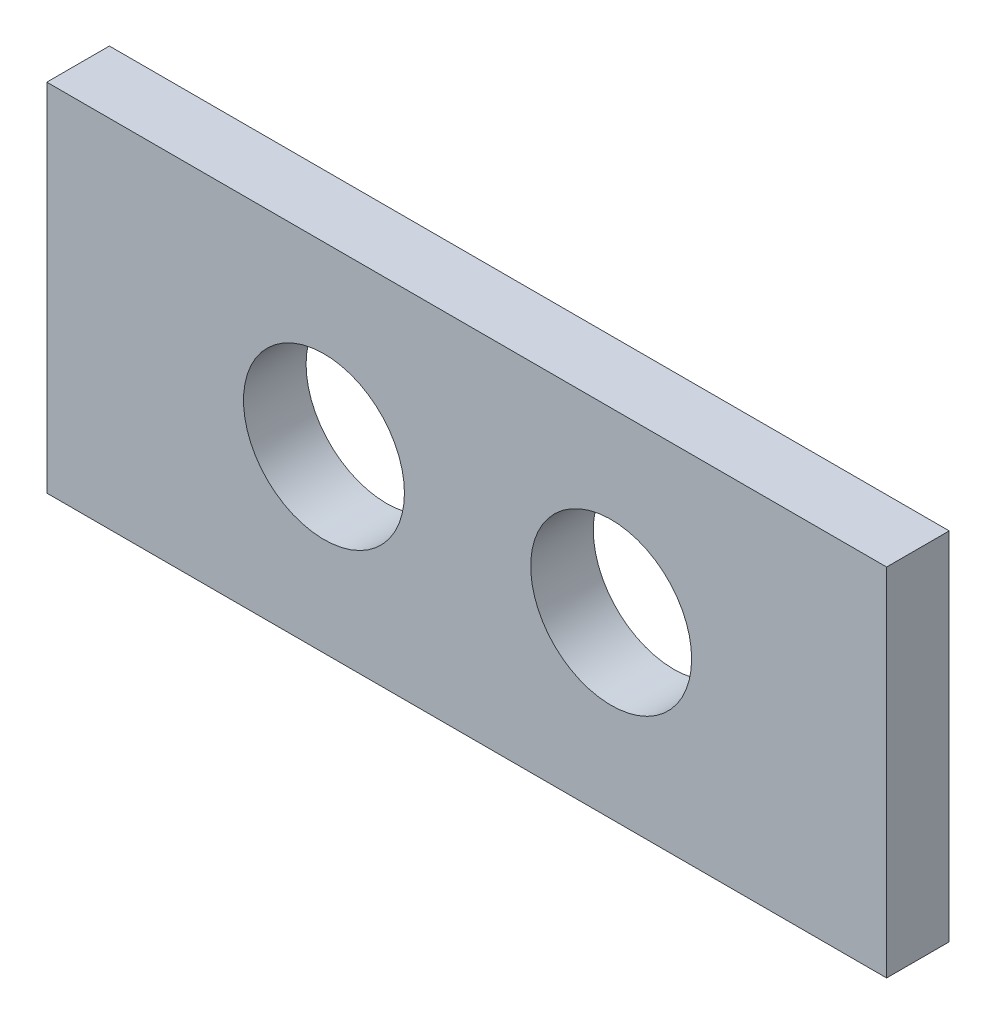
ISO-10303-21;
HEADER;
FILE_DESCRIPTION(('STEP AP214'),'2;1');
FILE_NAME('part.step','',(''),(''),'','','');
FILE_SCHEMA(('AUTOMOTIVE_DESIGN { 1 0 10303 214 1 1 1 1 }'));
ENDSEC;
DATA;
#1=APPLICATION_CONTEXT('core data for automotive mechanical design processes');
#2=APPLICATION_PROTOCOL_DEFINITION('international standard','automotive_design',2000,#1);
#3=PRODUCT_CONTEXT('',#1,'mechanical');
#4=PRODUCT('Part','Part','',(#3));
#5=PRODUCT_RELATED_PRODUCT_CATEGORY('part','',(#4));
#6=PRODUCT_DEFINITION_FORMATION('','',#4);
#7=PRODUCT_DEFINITION_CONTEXT('part definition',#1,'design');
#8=PRODUCT_DEFINITION('design','',#6,#7);
#9=PRODUCT_DEFINITION_SHAPE('','',#8);
#10=(LENGTH_UNIT() NAMED_UNIT(*) SI_UNIT(.MILLI.,.METRE.));
#11=(NAMED_UNIT(*) PLANE_ANGLE_UNIT() SI_UNIT($,.RADIAN.));
#12=(NAMED_UNIT(*) SI_UNIT($,.STERADIAN.) SOLID_ANGLE_UNIT());
#13=UNCERTAINTY_MEASURE_WITH_UNIT(LENGTH_MEASURE(1.E-05),#10,'distance_accuracy_value','');
#14=(GEOMETRIC_REPRESENTATION_CONTEXT(3) GLOBAL_UNCERTAINTY_ASSIGNED_CONTEXT((#13)) GLOBAL_UNIT_ASSIGNED_CONTEXT((#10,
#11,#12)) REPRESENTATION_CONTEXT('',''));
#15=CARTESIAN_POINT('',(0.,0.,0.));
#16=DIRECTION('',(0.,0.,1.));
#17=DIRECTION('',(1.,0.,0.));
#18=AXIS2_PLACEMENT_3D('',#15,#16,#17);
#19=CARTESIAN_POINT('',(0.,0.,228.01579999998));
#20=DIRECTION('',(0.,0.,-1.));
#21=DIRECTION('',(-1.,0.,0.));
#22=AXIS2_PLACEMENT_3D('',#19,#20,#21);
#23=PLANE('',#22);
#24=DIRECTION('',(0.,-1.,0.));
#25=VECTOR('',#24,1.);
#26=CARTESIAN_POINT('',(99.8991867373068,-267.892021918219,228.01579999998));
#27=LINE('',#26,#25);
#28=CARTESIAN_POINT('',(99.8991867373068,31.4461867373068,228.01579999998));
#29=VERTEX_POINT('',#28);
#30=CARTESIAN_POINT('',(99.8991867373068,-31.75,228.01579999998));
#31=VERTEX_POINT('',#30);
#32=EDGE_CURVE('E99',#29,#31,#27,.T.);
#33=ORIENTED_EDGE('',*,*,#32,.T.);
#34=DIRECTION('',(1.,0.,0.));
#35=VECTOR('',#34,1.);
#36=CARTESIAN_POINT('',(-399952.451462166,-31.75,228.01579999998));
#37=LINE('',#36,#35);
#38=CARTESIAN_POINT('',(-49.212499999991,-31.75,228.01579999998));
#39=VERTEX_POINT('',#38);
#40=EDGE_CURVE('E94',#39,#31,#37,.T.);
#41=ORIENTED_EDGE('',*,*,#40,.F.);
#42=DIRECTION('',(0.,1.,0.));
#43=VECTOR('',#42,1.);
#44=CARTESIAN_POINT('',(-49.212499999991,-267.892021918219,228.01579999998));
#45=LINE('',#44,#43);
#46=CARTESIAN_POINT('',(-49.212499999991,31.4461867373068,228.01579999998));
#47=VERTEX_POINT('',#46);
#48=EDGE_CURVE('E98',#39,#47,#45,.T.);
#49=ORIENTED_EDGE('',*,*,#48,.T.);
#50=DIRECTION('',(-1.,0.,0.));
#51=VECTOR('',#50,1.);
#52=CARTESIAN_POINT('',(-399952.451462166,31.4461867373068,228.01579999998));
#53=LINE('',#52,#51);
#54=EDGE_CURVE('E85',#29,#47,#53,.T.);
#55=ORIENTED_EDGE('',*,*,#54,.F.);
#56=EDGE_LOOP('',(#33,#41,#49,#55));
#57=FACE_BOUND('',#56,.T.);
#58=CARTESIAN_POINT('',(0.,0.,228.01579999998));
#59=DIRECTION('',(0.,0.,-1.));
#60=DIRECTION('',(-1.,0.,0.));
#61=AXIS2_PLACEMENT_3D('',#58,#59,#60);
#62=CIRCLE('',#61,14.2875);
#63=CARTESIAN_POINT('',(-14.2875,0.,228.01579999998));
#64=VERTEX_POINT('',#63);
#65=EDGE_CURVE('E134',#64,#64,#62,.T.);
#66=ORIENTED_EDGE('',*,*,#65,.F.);
#67=EDGE_LOOP('',(#66));
#68=FACE_BOUND('',#67,.T.);
#69=CARTESIAN_POINT('',(50.9905,0.,228.01579999998));
#70=DIRECTION('',(0.,0.,-1.));
#71=DIRECTION('',(-1.,0.,0.));
#72=AXIS2_PLACEMENT_3D('',#69,#70,#71);
#73=CIRCLE('',#72,14.2875);
#74=CARTESIAN_POINT('',(36.703,0.,228.01579999998));
#75=VERTEX_POINT('',#74);
#76=EDGE_CURVE('E141',#75,#75,#73,.T.);
#77=ORIENTED_EDGE('',*,*,#76,.F.);
#78=EDGE_LOOP('',(#77));
#79=FACE_BOUND('',#78,.T.);
#80=ADVANCED_FACE('F45',(#57,#68,#79),#23,.T.);
#81=CARTESIAN_POINT('',(-49.2124999999533,-267.892021918219,291697.77222));
#82=DIRECTION('',(1.,0.,0.));
#83=DIRECTION('',(0.,0.,-1.));
#84=AXIS2_PLACEMENT_3D('',#81,#82,#83);
#85=PLANE('',#84);
#86=ORIENTED_EDGE('',*,*,#48,.F.);
#87=DIRECTION('',(0.,0.,1.));
#88=VECTOR('',#87,1.);
#89=CARTESIAN_POINT('',(-49.2124999999533,-31.75,291697.77222));
#90=LINE('',#89,#88);
#91=CARTESIAN_POINT('',(-49.212499999991,-31.75,239.128300000004));
#92=VERTEX_POINT('',#91);
#93=EDGE_CURVE('E103',#39,#92,#90,.T.);
#94=ORIENTED_EDGE('',*,*,#93,.T.);
#95=DIRECTION('',(0.,1.,0.));
#96=VECTOR('',#95,1.);
#97=CARTESIAN_POINT('',(-49.212499999991,-267.892021918219,239.128300000004));
#98=LINE('',#97,#96);
#99=CARTESIAN_POINT('',(-49.212499999991,31.4461867373068,239.128300000004));
#100=VERTEX_POINT('',#99);
#101=EDGE_CURVE('E111',#92,#100,#98,.T.);
#102=ORIENTED_EDGE('',*,*,#101,.T.);
#103=DIRECTION('',(0.,0.,-1.));
#104=VECTOR('',#103,1.);
#105=CARTESIAN_POINT('',(-49.2124999999533,31.4461867373068,291697.77222));
#106=LINE('',#105,#104);
#107=EDGE_CURVE('E101',#100,#47,#106,.T.);
#108=ORIENTED_EDGE('',*,*,#107,.T.);
#109=EDGE_LOOP('',(#86,#94,#102,#108));
#110=FACE_BOUND('',#109,.T.);
#111=ADVANCED_FACE('F113',(#110),#85,.F.);
#112=CARTESIAN_POINT('',(-399952.451462166,-267.892021918219,239.128300000004));
#113=DIRECTION('',(0.,0.,-1.));
#114=DIRECTION('',(-1.,0.,0.));
#115=AXIS2_PLACEMENT_3D('',#112,#113,#114);
#116=PLANE('',#115);
#117=CARTESIAN_POINT('',(0.,0.,239.128300000004));
#118=DIRECTION('',(0.,0.,1.));
#119=DIRECTION('',(1.,0.,0.));
#120=AXIS2_PLACEMENT_3D('',#117,#118,#119);
#121=CIRCLE('',#120,14.2875);
#122=CARTESIAN_POINT('',(14.2875,0.,239.128300000004));
#123=VERTEX_POINT('',#122);
#124=EDGE_CURVE('E56',#123,#123,#121,.T.);
#125=ORIENTED_EDGE('',*,*,#124,.F.);
#126=EDGE_LOOP('',(#125));
#127=FACE_BOUND('',#126,.T.);
#128=CARTESIAN_POINT('',(50.9905,0.,239.128300000004));
#129=DIRECTION('',(0.,0.,1.));
#130=DIRECTION('',(1.,0.,0.));
#131=AXIS2_PLACEMENT_3D('',#128,#129,#130);
#132=CIRCLE('',#131,14.2875);
#133=CARTESIAN_POINT('',(65.278,0.,239.128300000004));
#134=VERTEX_POINT('',#133);
#135=EDGE_CURVE('E11',#134,#134,#132,.T.);
#136=ORIENTED_EDGE('',*,*,#135,.F.);
#137=EDGE_LOOP('',(#136));
#138=FACE_BOUND('',#137,.T.);
#139=ORIENTED_EDGE('',*,*,#101,.F.);
#140=DIRECTION('',(1.,0.,0.));
#141=VECTOR('',#140,1.);
#142=CARTESIAN_POINT('',(-399952.451462166,-31.75,239.128300000004));
#143=LINE('',#142,#141);
#144=CARTESIAN_POINT('',(99.899186737332,-31.75,239.128300000004));
#145=VERTEX_POINT('',#144);
#146=EDGE_CURVE('E106',#92,#145,#143,.T.);
#147=ORIENTED_EDGE('',*,*,#146,.T.);
#148=DIRECTION('',(0.,1.,0.));
#149=VECTOR('',#148,1.);
#150=CARTESIAN_POINT('',(99.899186737332,-267.892021918219,239.128300000004));
#151=LINE('',#150,#149);
#152=CARTESIAN_POINT('',(99.899186737332,31.4461867373068,239.128300000004));
#153=VERTEX_POINT('',#152);
#154=EDGE_CURVE('E124',#145,#153,#151,.T.);
#155=ORIENTED_EDGE('',*,*,#154,.T.);
#156=DIRECTION('',(-1.,0.,0.));
#157=VECTOR('',#156,1.);
#158=CARTESIAN_POINT('',(-399952.451462166,31.4461867373068,239.128300000004));
#159=LINE('',#158,#157);
#160=EDGE_CURVE('E110',#153,#100,#159,.T.);
#161=ORIENTED_EDGE('',*,*,#160,.T.);
#162=EDGE_LOOP('',(#139,#147,#155,#161));
#163=FACE_BOUND('',#162,.T.);
#164=ADVANCED_FACE('F149',(#127,#138,#163),#116,.F.);
#165=CARTESIAN_POINT('',(0.,0.,56.0196999999789));
#166=DIRECTION('',(0.,0.,1.));
#167=DIRECTION('',(1.,0.,0.));
#168=AXIS2_PLACEMENT_3D('',#165,#166,#167);
#169=CYLINDRICAL_SURFACE('',#168,14.2875);
#170=ORIENTED_EDGE('',*,*,#65,.T.);
#171=EDGE_LOOP('',(#170));
#172=FACE_BOUND('',#171,.T.);
#173=ORIENTED_EDGE('',*,*,#124,.T.);
#174=EDGE_LOOP('',(#173));
#175=FACE_BOUND('',#174,.T.);
#176=ADVANCED_FACE('F47',(#172,#175),#169,.F.);
#177=CARTESIAN_POINT('',(50.9905,0.,56.0196999999789));
#178=DIRECTION('',(0.,0.,1.));
#179=DIRECTION('',(1.,0.,0.));
#180=AXIS2_PLACEMENT_3D('',#177,#178,#179);
#181=CYLINDRICAL_SURFACE('',#180,14.2875);
#182=ORIENTED_EDGE('',*,*,#76,.T.);
#183=EDGE_LOOP('',(#182));
#184=FACE_BOUND('',#183,.T.);
#185=ORIENTED_EDGE('',*,*,#135,.T.);
#186=EDGE_LOOP('',(#185));
#187=FACE_BOUND('',#186,.T.);
#188=ADVANCED_FACE('F172',(#184,#187),#181,.F.);
#189=CARTESIAN_POINT('',(99.899186737332,-267.892021918219,291697.77222));
#190=DIRECTION('',(-1.,0.,0.));
#191=DIRECTION('',(0.,0.,1.));
#192=AXIS2_PLACEMENT_3D('',#189,#190,#191);
#193=PLANE('',#192);
#194=ORIENTED_EDGE('',*,*,#32,.F.);
#195=DIRECTION('',(0.,0.,1.));
#196=VECTOR('',#195,1.);
#197=CARTESIAN_POINT('',(99.899186737332,31.4461867373068,291697.77222));
#198=LINE('',#197,#196);
#199=EDGE_CURVE('E65',#29,#153,#198,.T.);
#200=ORIENTED_EDGE('',*,*,#199,.T.);
#201=ORIENTED_EDGE('',*,*,#154,.F.);
#202=DIRECTION('',(0.,0.,-1.));
#203=VECTOR('',#202,1.);
#204=CARTESIAN_POINT('',(99.899186737332,-31.75,291697.77222));
#205=LINE('',#204,#203);
#206=EDGE_CURVE('E49',#145,#31,#205,.T.);
#207=ORIENTED_EDGE('',*,*,#206,.T.);
#208=EDGE_LOOP('',(#194,#200,#201,#207));
#209=FACE_BOUND('',#208,.T.);
#210=ADVANCED_FACE('F162',(#209),#193,.F.);
#211=CARTESIAN_POINT('',(0.,-31.75,0.));
#212=DIRECTION('',(0.,1.,0.));
#213=DIRECTION('',(0.,0.,1.));
#214=AXIS2_PLACEMENT_3D('',#211,#212,#213);
#215=PLANE('',#214);
#216=ORIENTED_EDGE('',*,*,#40,.T.);
#217=ORIENTED_EDGE('',*,*,#206,.F.);
#218=ORIENTED_EDGE('',*,*,#146,.F.);
#219=ORIENTED_EDGE('',*,*,#93,.F.);
#220=EDGE_LOOP('',(#216,#217,#218,#219));
#221=FACE_BOUND('',#220,.T.);
#222=ADVANCED_FACE('F104',(#221),#215,.F.);
#223=CARTESIAN_POINT('',(0.,31.4461867373068,0.));
#224=DIRECTION('',(0.,-1.,0.));
#225=DIRECTION('',(0.,0.,-1.));
#226=AXIS2_PLACEMENT_3D('',#223,#224,#225);
#227=PLANE('',#226);
#228=ORIENTED_EDGE('',*,*,#54,.T.);
#229=ORIENTED_EDGE('',*,*,#107,.F.);
#230=ORIENTED_EDGE('',*,*,#160,.F.);
#231=ORIENTED_EDGE('',*,*,#199,.F.);
#232=EDGE_LOOP('',(#228,#229,#230,#231));
#233=FACE_BOUND('',#232,.T.);
#234=ADVANCED_FACE('F155',(#233),#227,.F.);
#235=CLOSED_SHELL('',(#80,#111,#164,#176,#188,#210,#222,#234));
#236=MANIFOLD_SOLID_BREP('B2',#235);
#237=ADVANCED_BREP_SHAPE_REPRESENTATION('',(#18,#236),#14);
#238=SHAPE_DEFINITION_REPRESENTATION(#9,#237);
ENDSEC;
END-ISO-10303-21;
